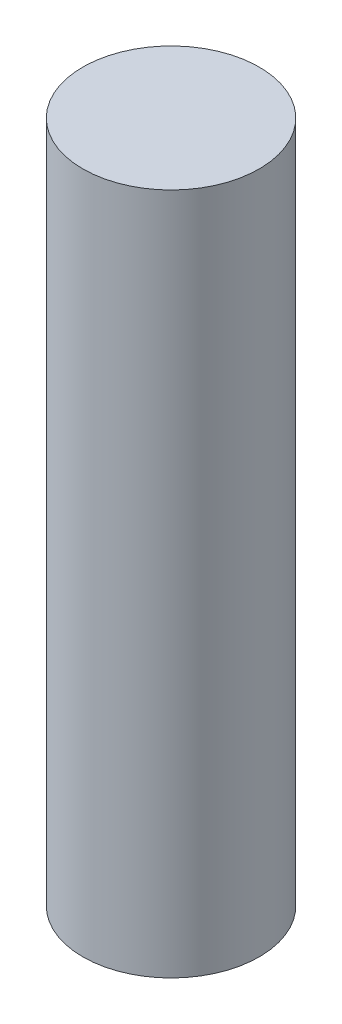
ISO-10303-21;
HEADER;
FILE_DESCRIPTION(('STEP AP214'),'2;1');
FILE_NAME('part.step','',(''),(''),'','','');
FILE_SCHEMA(('AUTOMOTIVE_DESIGN { 1 0 10303 214 1 1 1 1 }'));
ENDSEC;
DATA;
#1=APPLICATION_CONTEXT('core data for automotive mechanical design processes');
#2=APPLICATION_PROTOCOL_DEFINITION('international standard','automotive_design',2000,#1);
#3=PRODUCT_CONTEXT('',#1,'mechanical');
#4=PRODUCT('Part','Part','',(#3));
#5=PRODUCT_RELATED_PRODUCT_CATEGORY('part','',(#4));
#6=PRODUCT_DEFINITION_FORMATION('','',#4);
#7=PRODUCT_DEFINITION_CONTEXT('part definition',#1,'design');
#8=PRODUCT_DEFINITION('design','',#6,#7);
#9=PRODUCT_DEFINITION_SHAPE('','',#8);
#10=(LENGTH_UNIT() NAMED_UNIT(*) SI_UNIT(.MILLI.,.METRE.));
#11=(NAMED_UNIT(*) PLANE_ANGLE_UNIT() SI_UNIT($,.RADIAN.));
#12=(NAMED_UNIT(*) SI_UNIT($,.STERADIAN.) SOLID_ANGLE_UNIT());
#13=UNCERTAINTY_MEASURE_WITH_UNIT(LENGTH_MEASURE(1.E-05),#10,'distance_accuracy_value','');
#14=(GEOMETRIC_REPRESENTATION_CONTEXT(3) GLOBAL_UNCERTAINTY_ASSIGNED_CONTEXT((#13)) GLOBAL_UNIT_ASSIGNED_CONTEXT((#10,
#11,#12)) REPRESENTATION_CONTEXT('',''));
#15=CARTESIAN_POINT('',(0.,0.,0.));
#16=DIRECTION('',(0.,0.,1.));
#17=DIRECTION('',(1.,0.,0.));
#18=AXIS2_PLACEMENT_3D('',#15,#16,#17);
#19=CARTESIAN_POINT('',(0.,70.,0.));
#20=DIRECTION('',(0.,-1.,0.));
#21=DIRECTION('',(0.,0.,-1.));
#22=AXIS2_PLACEMENT_3D('',#19,#20,#21);
#23=CYLINDRICAL_SURFACE('',#22,9.05000000011569);
#24=CARTESIAN_POINT('',(0.,70.,0.));
#25=DIRECTION('',(0.,1.,0.));
#26=DIRECTION('',(0.,0.,1.));
#27=AXIS2_PLACEMENT_3D('',#24,#25,#26);
#28=CIRCLE('',#27,9.05000000011569);
#29=CARTESIAN_POINT('',(0.,70.,9.05000000011569));
#30=VERTEX_POINT('',#29);
#31=EDGE_CURVE('E12',#30,#30,#28,.T.);
#32=ORIENTED_EDGE('',*,*,#31,.F.);
#33=EDGE_LOOP('',(#32));
#34=FACE_BOUND('',#33,.T.);
#35=CARTESIAN_POINT('',(0.,0.,0.));
#36=DIRECTION('',(0.,1.,0.));
#37=DIRECTION('',(0.,0.,1.));
#38=AXIS2_PLACEMENT_3D('',#35,#36,#37);
#39=CIRCLE('',#38,9.05000000011569);
#40=CARTESIAN_POINT('',(0.,0.,9.05000000011569));
#41=VERTEX_POINT('',#40);
#42=EDGE_CURVE('E44',#41,#41,#39,.T.);
#43=ORIENTED_EDGE('',*,*,#42,.T.);
#44=EDGE_LOOP('',(#43));
#45=FACE_BOUND('',#44,.T.);
#46=ADVANCED_FACE('F41',(#34,#45),#23,.T.);
#47=CARTESIAN_POINT('',(0.,70.,0.));
#48=DIRECTION('',(0.,1.,0.));
#49=DIRECTION('',(0.,0.,1.));
#50=AXIS2_PLACEMENT_3D('',#47,#48,#49);
#51=PLANE('',#50);
#52=ORIENTED_EDGE('',*,*,#31,.T.);
#53=EDGE_LOOP('',(#52));
#54=FACE_BOUND('',#53,.T.);
#55=ADVANCED_FACE('F56',(#54),#51,.T.);
#56=CARTESIAN_POINT('',(0.,0.,0.));
#57=DIRECTION('',(0.,1.,0.));
#58=DIRECTION('',(0.,0.,1.));
#59=AXIS2_PLACEMENT_3D('',#56,#57,#58);
#60=PLANE('',#59);
#61=ORIENTED_EDGE('',*,*,#42,.F.);
#62=EDGE_LOOP('',(#61));
#63=FACE_BOUND('',#62,.T.);
#64=ADVANCED_FACE('F54',(#63),#60,.F.);
#65=CLOSED_SHELL('',(#46,#55,#64));
#66=MANIFOLD_SOLID_BREP('B2',#65);
#67=ADVANCED_BREP_SHAPE_REPRESENTATION('',(#18,#66),#14);
#68=SHAPE_DEFINITION_REPRESENTATION(#9,#67);
ENDSEC;
END-ISO-10303-21;
